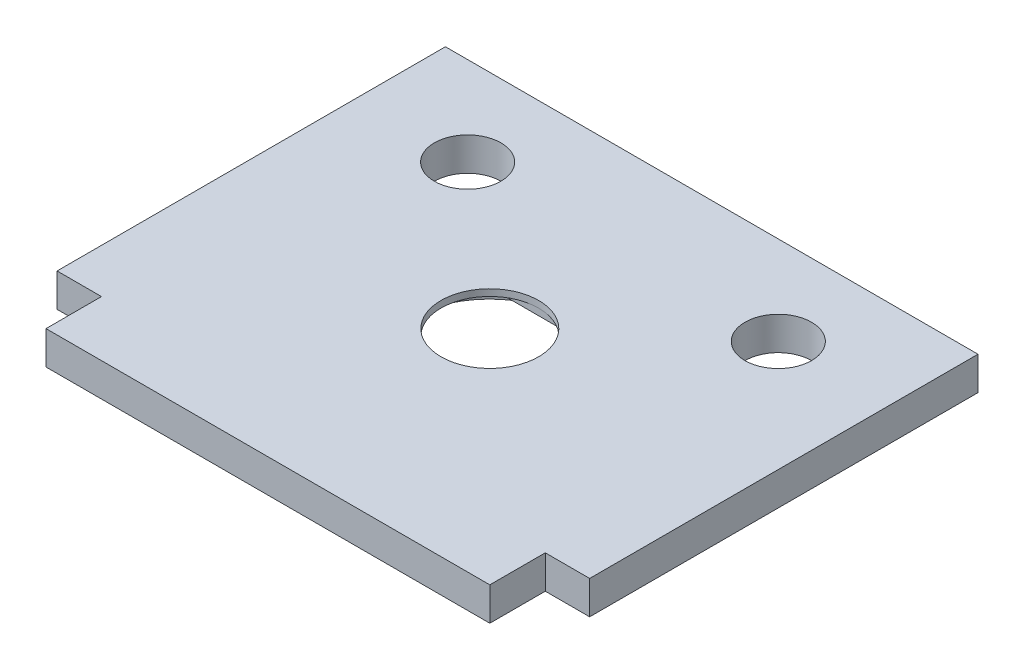
ISO-10303-21;
HEADER;
FILE_DESCRIPTION(('STEP AP214'),'2;1');
FILE_NAME('part.step','',(''),(''),'','','');
FILE_SCHEMA(('AUTOMOTIVE_DESIGN { 1 0 10303 214 1 1 1 1 }'));
ENDSEC;
DATA;
#1=APPLICATION_CONTEXT('core data for automotive mechanical design processes');
#2=APPLICATION_PROTOCOL_DEFINITION('international standard','automotive_design',2000,#1);
#3=PRODUCT_CONTEXT('',#1,'mechanical');
#4=PRODUCT('Part','Part','',(#3));
#5=PRODUCT_RELATED_PRODUCT_CATEGORY('part','',(#4));
#6=PRODUCT_DEFINITION_FORMATION('','',#4);
#7=PRODUCT_DEFINITION_CONTEXT('part definition',#1,'design');
#8=PRODUCT_DEFINITION('design','',#6,#7);
#9=PRODUCT_DEFINITION_SHAPE('','',#8);
#10=(LENGTH_UNIT() NAMED_UNIT(*) SI_UNIT(.MILLI.,.METRE.));
#11=(NAMED_UNIT(*) PLANE_ANGLE_UNIT() SI_UNIT($,.RADIAN.));
#12=(NAMED_UNIT(*) SI_UNIT($,.STERADIAN.) SOLID_ANGLE_UNIT());
#13=UNCERTAINTY_MEASURE_WITH_UNIT(LENGTH_MEASURE(1.E-05),#10,'distance_accuracy_value','');
#14=(GEOMETRIC_REPRESENTATION_CONTEXT(3) GLOBAL_UNCERTAINTY_ASSIGNED_CONTEXT((#13)) GLOBAL_UNIT_ASSIGNED_CONTEXT((#10,
#11,#12)) REPRESENTATION_CONTEXT('',''));
#15=CARTESIAN_POINT('',(0.,0.,0.));
#16=DIRECTION('',(0.,0.,1.));
#17=DIRECTION('',(1.,0.,0.));
#18=AXIS2_PLACEMENT_3D('',#15,#16,#17);
#19=CARTESIAN_POINT('',(-1.4300518134715,0.9,-7.5));
#20=DIRECTION('',(0.,-1.,0.));
#21=DIRECTION('',(0.,0.,-1.));
#22=AXIS2_PLACEMENT_3D('',#19,#20,#21);
#23=PLANE('',#22);
#24=DIRECTION('',(1.,0.,0.));
#25=VECTOR('',#24,1.);
#26=CARTESIAN_POINT('',(1.60680511434054,0.9,-9.7));
#27=LINE('',#26,#25);
#28=CARTESIAN_POINT('',(-4.46690874128355,0.9,-9.7));
#29=VERTEX_POINT('',#28);
#30=CARTESIAN_POINT('',(1.60680511434054,0.9,-9.7));
#31=VERTEX_POINT('',#30);
#32=EDGE_CURVE('E269',#29,#31,#27,.T.);
#33=ORIENTED_EDGE('',*,*,#32,.F.);
#34=CARTESIAN_POINT('',(-1.4300518134715,0.9,-7.5));
#35=DIRECTION('',(0.,-1.,0.));
#36=DIRECTION('',(0.,0.,-1.));
#37=AXIS2_PLACEMENT_3D('',#34,#35,#36);
#38=CIRCLE('',#37,3.75);
#39=EDGE_CURVE('E208',#29,#31,#38,.T.);
#40=ORIENTED_EDGE('',*,*,#39,.T.);
#41=EDGE_LOOP('',(#33,#40));
#42=FACE_BOUND('',#41,.T.);
#43=ADVANCED_FACE('F39',(#42),#23,.T.);
#44=CARTESIAN_POINT('',(-1.4300518134715,1.8,-7.5));
#45=DIRECTION('',(0.,-1.,0.));
#46=DIRECTION('',(0.,0.,-1.));
#47=AXIS2_PLACEMENT_3D('',#44,#45,#46);
#48=CYLINDRICAL_SURFACE('',#47,2.2);
#49=CARTESIAN_POINT('',(-1.4300518134715,1.5,-7.5));
#50=DIRECTION('',(0.,1.,0.));
#51=DIRECTION('',(0.,0.,1.));
#52=AXIS2_PLACEMENT_3D('',#49,#50,#51);
#53=CIRCLE('',#52,2.2);
#54=CARTESIAN_POINT('',(-1.4300518134715,1.5,-5.3));
#55=VERTEX_POINT('',#54);
#56=EDGE_CURVE('E198',#55,#55,#53,.T.);
#57=ORIENTED_EDGE('',*,*,#56,.T.);
#58=EDGE_LOOP('',(#57));
#59=FACE_BOUND('',#58,.T.);
#60=CARTESIAN_POINT('',(-1.4300518134715,1.2,-7.5));
#61=DIRECTION('',(0.,-1.,0.));
#62=DIRECTION('',(0.,0.,-1.));
#63=AXIS2_PLACEMENT_3D('',#60,#61,#62);
#64=CIRCLE('',#63,2.2);
#65=CARTESIAN_POINT('',(-1.4300518134715,1.2,-9.7));
#66=VERTEX_POINT('',#65);
#67=CARTESIAN_POINT('',(-1.4300518134715,1.2,-5.3));
#68=VERTEX_POINT('',#67);
#69=EDGE_CURVE('E11',#66,#68,#64,.F.);
#70=ORIENTED_EDGE('',*,*,#69,.F.);
#71=EDGE_CURVE('E43',#68,#66,#64,.F.);
#72=ORIENTED_EDGE('',*,*,#71,.F.);
#73=EDGE_LOOP('',(#70,#72));
#74=FACE_BOUND('',#73,.T.);
#75=ADVANCED_FACE('F299',(#59,#74),#48,.F.);
#76=CARTESIAN_POINT('',(10.5699481865285,1.5,-17.5));
#77=DIRECTION('',(0.,0.,1.));
#78=DIRECTION('',(1.,0.,0.));
#79=AXIS2_PLACEMENT_3D('',#76,#77,#78);
#80=PLANE('',#79);
#81=DIRECTION('',(-1.,0.,0.));
#82=VECTOR('',#81,1.);
#83=CARTESIAN_POINT('',(10.5699481865285,0.,-17.5));
#84=LINE('',#83,#82);
#85=CARTESIAN_POINT('',(10.5699481865285,0.,-17.5));
#86=VERTEX_POINT('',#85);
#87=CARTESIAN_POINT('',(-13.4300518134715,0.,-17.5));
#88=VERTEX_POINT('',#87);
#89=EDGE_CURVE('E153',#86,#88,#84,.T.);
#90=ORIENTED_EDGE('',*,*,#89,.T.);
#91=DIRECTION('',(0.,-1.,0.));
#92=VECTOR('',#91,1.);
#93=CARTESIAN_POINT('',(-13.4300518134715,1.5,-17.5));
#94=LINE('',#93,#92);
#95=CARTESIAN_POINT('',(-13.4300518134715,1.5,-17.5));
#96=VERTEX_POINT('',#95);
#97=EDGE_CURVE('E196',#96,#88,#94,.T.);
#98=ORIENTED_EDGE('',*,*,#97,.F.);
#99=DIRECTION('',(-1.,0.,0.));
#100=VECTOR('',#99,1.);
#101=CARTESIAN_POINT('',(10.5699481865285,1.5,-17.5));
#102=LINE('',#101,#100);
#103=CARTESIAN_POINT('',(10.5699481865285,1.5,-17.5));
#104=VERTEX_POINT('',#103);
#105=EDGE_CURVE('E177',#104,#96,#102,.T.);
#106=ORIENTED_EDGE('',*,*,#105,.F.);
#107=DIRECTION('',(0.,-1.,0.));
#108=VECTOR('',#107,1.);
#109=CARTESIAN_POINT('',(10.5699481865285,1.5,-17.5));
#110=LINE('',#109,#108);
#111=EDGE_CURVE('E149',#104,#86,#110,.T.);
#112=ORIENTED_EDGE('',*,*,#111,.T.);
#113=EDGE_LOOP('',(#90,#98,#106,#112));
#114=FACE_BOUND('',#113,.T.);
#115=ADVANCED_FACE('F41',(#114),#80,.F.);
#116=CARTESIAN_POINT('',(-13.4300518134715,1.5,-17.5));
#117=DIRECTION('',(1.,0.,0.));
#118=DIRECTION('',(0.,0.,-1.));
#119=AXIS2_PLACEMENT_3D('',#116,#117,#118);
#120=PLANE('',#119);
#121=DIRECTION('',(0.,0.,1.));
#122=VECTOR('',#121,1.);
#123=CARTESIAN_POINT('',(-13.4300518134715,0.,-17.5));
#124=LINE('',#123,#122);
#125=CARTESIAN_POINT('',(-13.4300518134715,0.,0.));
#126=VERTEX_POINT('',#125);
#127=EDGE_CURVE('E157',#88,#126,#124,.T.);
#128=ORIENTED_EDGE('',*,*,#127,.T.);
#129=DIRECTION('',(0.,-1.,0.));
#130=VECTOR('',#129,1.);
#131=CARTESIAN_POINT('',(-13.4300518134715,1.5,0.));
#132=LINE('',#131,#130);
#133=CARTESIAN_POINT('',(-13.4300518134715,1.5,0.));
#134=VERTEX_POINT('',#133);
#135=EDGE_CURVE('E192',#134,#126,#132,.T.);
#136=ORIENTED_EDGE('',*,*,#135,.F.);
#137=DIRECTION('',(0.,0.,1.));
#138=VECTOR('',#137,1.);
#139=CARTESIAN_POINT('',(-13.4300518134715,1.5,-17.5));
#140=LINE('',#139,#138);
#141=EDGE_CURVE('E106',#96,#134,#140,.T.);
#142=ORIENTED_EDGE('',*,*,#141,.F.);
#143=ORIENTED_EDGE('',*,*,#97,.T.);
#144=EDGE_LOOP('',(#128,#136,#142,#143));
#145=FACE_BOUND('',#144,.T.);
#146=ADVANCED_FACE('F306',(#145),#120,.F.);
#147=CARTESIAN_POINT('',(-13.4300518134715,1.5,0.));
#148=DIRECTION('',(0.,0.,-1.));
#149=DIRECTION('',(-1.,0.,0.));
#150=AXIS2_PLACEMENT_3D('',#147,#148,#149);
#151=PLANE('',#150);
#152=DIRECTION('',(1.,0.,0.));
#153=VECTOR('',#152,1.);
#154=CARTESIAN_POINT('',(-13.4300518134715,0.,0.));
#155=LINE('',#154,#153);
#156=CARTESIAN_POINT('',(-11.4300518134715,0.,0.));
#157=VERTEX_POINT('',#156);
#158=EDGE_CURVE('E161',#126,#157,#155,.T.);
#159=ORIENTED_EDGE('',*,*,#158,.T.);
#160=DIRECTION('',(0.,-1.,0.));
#161=VECTOR('',#160,1.);
#162=CARTESIAN_POINT('',(-11.4300518134715,1.5,0.));
#163=LINE('',#162,#161);
#164=CARTESIAN_POINT('',(-11.4300518134715,1.5,0.));
#165=VERTEX_POINT('',#164);
#166=EDGE_CURVE('E188',#165,#157,#163,.T.);
#167=ORIENTED_EDGE('',*,*,#166,.F.);
#168=DIRECTION('',(1.,0.,0.));
#169=VECTOR('',#168,1.);
#170=CARTESIAN_POINT('',(-13.4300518134715,1.5,0.));
#171=LINE('',#170,#169);
#172=EDGE_CURVE('E228',#134,#165,#171,.T.);
#173=ORIENTED_EDGE('',*,*,#172,.F.);
#174=ORIENTED_EDGE('',*,*,#135,.T.);
#175=EDGE_LOOP('',(#159,#167,#173,#174));
#176=FACE_BOUND('',#175,.T.);
#177=ADVANCED_FACE('F338',(#176),#151,.F.);
#178=CARTESIAN_POINT('',(-11.4300518134715,1.5,0.));
#179=DIRECTION('',(1.,0.,0.));
#180=DIRECTION('',(0.,0.,-1.));
#181=AXIS2_PLACEMENT_3D('',#178,#179,#180);
#182=PLANE('',#181);
#183=DIRECTION('',(0.,0.,1.));
#184=VECTOR('',#183,1.);
#185=CARTESIAN_POINT('',(-11.4300518134715,0.,0.));
#186=LINE('',#185,#184);
#187=CARTESIAN_POINT('',(-11.4300518134715,0.,2.5));
#188=VERTEX_POINT('',#187);
#189=EDGE_CURVE('E164',#157,#188,#186,.T.);
#190=ORIENTED_EDGE('',*,*,#189,.T.);
#191=DIRECTION('',(0.,-1.,0.));
#192=VECTOR('',#191,1.);
#193=CARTESIAN_POINT('',(-11.4300518134715,1.5,2.5));
#194=LINE('',#193,#192);
#195=CARTESIAN_POINT('',(-11.4300518134715,1.5,2.5));
#196=VERTEX_POINT('',#195);
#197=EDGE_CURVE('E184',#196,#188,#194,.T.);
#198=ORIENTED_EDGE('',*,*,#197,.F.);
#199=DIRECTION('',(0.,0.,1.));
#200=VECTOR('',#199,1.);
#201=CARTESIAN_POINT('',(-11.4300518134715,1.5,0.));
#202=LINE('',#201,#200);
#203=EDGE_CURVE('E231',#165,#196,#202,.T.);
#204=ORIENTED_EDGE('',*,*,#203,.F.);
#205=ORIENTED_EDGE('',*,*,#166,.T.);
#206=EDGE_LOOP('',(#190,#198,#204,#205));
#207=FACE_BOUND('',#206,.T.);
#208=ADVANCED_FACE('F334',(#207),#182,.F.);
#209=CARTESIAN_POINT('',(-11.4300518134715,1.5,2.5));
#210=DIRECTION('',(0.,0.,-1.));
#211=DIRECTION('',(-1.,0.,0.));
#212=AXIS2_PLACEMENT_3D('',#209,#210,#211);
#213=PLANE('',#212);
#214=DIRECTION('',(1.,0.,0.));
#215=VECTOR('',#214,1.);
#216=CARTESIAN_POINT('',(-11.4300518134715,0.,2.5));
#217=LINE('',#216,#215);
#218=CARTESIAN_POINT('',(8.5699481865285,0.,2.5));
#219=VERTEX_POINT('',#218);
#220=EDGE_CURVE('E167',#188,#219,#217,.T.);
#221=ORIENTED_EDGE('',*,*,#220,.T.);
#222=DIRECTION('',(0.,-1.,0.));
#223=VECTOR('',#222,1.);
#224=CARTESIAN_POINT('',(8.5699481865285,1.5,2.5));
#225=LINE('',#224,#223);
#226=CARTESIAN_POINT('',(8.5699481865285,1.5,2.5));
#227=VERTEX_POINT('',#226);
#228=EDGE_CURVE('E142',#227,#219,#225,.T.);
#229=ORIENTED_EDGE('',*,*,#228,.F.);
#230=DIRECTION('',(1.,0.,0.));
#231=VECTOR('',#230,1.);
#232=CARTESIAN_POINT('',(-11.4300518134715,1.5,2.5));
#233=LINE('',#232,#231);
#234=EDGE_CURVE('E128',#196,#227,#233,.T.);
#235=ORIENTED_EDGE('',*,*,#234,.F.);
#236=ORIENTED_EDGE('',*,*,#197,.T.);
#237=EDGE_LOOP('',(#221,#229,#235,#236));
#238=FACE_BOUND('',#237,.T.);
#239=ADVANCED_FACE('F331',(#238),#213,.F.);
#240=CARTESIAN_POINT('',(8.5699481865285,1.5,2.5));
#241=DIRECTION('',(-1.,0.,0.));
#242=DIRECTION('',(0.,0.,1.));
#243=AXIS2_PLACEMENT_3D('',#240,#241,#242);
#244=PLANE('',#243);
#245=DIRECTION('',(0.,0.,-1.));
#246=VECTOR('',#245,1.);
#247=CARTESIAN_POINT('',(8.5699481865285,0.,2.5));
#248=LINE('',#247,#246);
#249=CARTESIAN_POINT('',(8.5699481865285,0.,0.));
#250=VERTEX_POINT('',#249);
#251=EDGE_CURVE('E138',#219,#250,#248,.T.);
#252=ORIENTED_EDGE('',*,*,#251,.T.);
#253=DIRECTION('',(0.,-1.,0.));
#254=VECTOR('',#253,1.);
#255=CARTESIAN_POINT('',(8.5699481865285,1.5,0.));
#256=LINE('',#255,#254);
#257=CARTESIAN_POINT('',(8.5699481865285,1.5,0.));
#258=VERTEX_POINT('',#257);
#259=EDGE_CURVE('E135',#258,#250,#256,.T.);
#260=ORIENTED_EDGE('',*,*,#259,.F.);
#261=DIRECTION('',(0.,0.,-1.));
#262=VECTOR('',#261,1.);
#263=CARTESIAN_POINT('',(8.5699481865285,1.5,2.5));
#264=LINE('',#263,#262);
#265=EDGE_CURVE('E121',#227,#258,#264,.T.);
#266=ORIENTED_EDGE('',*,*,#265,.F.);
#267=ORIENTED_EDGE('',*,*,#228,.T.);
#268=EDGE_LOOP('',(#252,#260,#266,#267));
#269=FACE_BOUND('',#268,.T.);
#270=ADVANCED_FACE('F136',(#269),#244,.F.);
#271=CARTESIAN_POINT('',(8.5699481865285,1.5,0.));
#272=DIRECTION('',(0.,0.,-1.));
#273=DIRECTION('',(-1.,0.,0.));
#274=AXIS2_PLACEMENT_3D('',#271,#272,#273);
#275=PLANE('',#274);
#276=DIRECTION('',(1.,0.,0.));
#277=VECTOR('',#276,1.);
#278=CARTESIAN_POINT('',(8.5699481865285,0.,0.));
#279=LINE('',#278,#277);
#280=CARTESIAN_POINT('',(10.5699481865285,0.,0.));
#281=VERTEX_POINT('',#280);
#282=EDGE_CURVE('E172',#250,#281,#279,.T.);
#283=ORIENTED_EDGE('',*,*,#282,.T.);
#284=DIRECTION('',(0.,-1.,0.));
#285=VECTOR('',#284,1.);
#286=CARTESIAN_POINT('',(10.5699481865285,1.5,0.));
#287=LINE('',#286,#285);
#288=CARTESIAN_POINT('',(10.5699481865285,1.5,0.));
#289=VERTEX_POINT('',#288);
#290=EDGE_CURVE('E143',#289,#281,#287,.T.);
#291=ORIENTED_EDGE('',*,*,#290,.F.);
#292=DIRECTION('',(1.,0.,0.));
#293=VECTOR('',#292,1.);
#294=CARTESIAN_POINT('',(8.5699481865285,1.5,0.));
#295=LINE('',#294,#293);
#296=EDGE_CURVE('E125',#258,#289,#295,.T.);
#297=ORIENTED_EDGE('',*,*,#296,.F.);
#298=ORIENTED_EDGE('',*,*,#259,.T.);
#299=EDGE_LOOP('',(#283,#291,#297,#298));
#300=FACE_BOUND('',#299,.T.);
#301=ADVANCED_FACE('F145',(#300),#275,.F.);
#302=CARTESIAN_POINT('',(10.5699481865285,1.5,0.));
#303=DIRECTION('',(-1.,0.,0.));
#304=DIRECTION('',(0.,0.,1.));
#305=AXIS2_PLACEMENT_3D('',#302,#303,#304);
#306=PLANE('',#305);
#307=DIRECTION('',(0.,0.,-1.));
#308=VECTOR('',#307,1.);
#309=CARTESIAN_POINT('',(10.5699481865285,0.,0.));
#310=LINE('',#309,#308);
#311=EDGE_CURVE('E97',#281,#86,#310,.T.);
#312=ORIENTED_EDGE('',*,*,#311,.T.);
#313=ORIENTED_EDGE('',*,*,#111,.F.);
#314=DIRECTION('',(0.,0.,-1.));
#315=VECTOR('',#314,1.);
#316=CARTESIAN_POINT('',(10.5699481865285,1.5,0.));
#317=LINE('',#316,#315);
#318=EDGE_CURVE('E64',#289,#104,#317,.T.);
#319=ORIENTED_EDGE('',*,*,#318,.F.);
#320=ORIENTED_EDGE('',*,*,#290,.T.);
#321=EDGE_LOOP('',(#312,#313,#319,#320));
#322=FACE_BOUND('',#321,.T.);
#323=ADVANCED_FACE('F320',(#322),#306,.F.);
#324=CARTESIAN_POINT('',(0.,1.5,0.));
#325=DIRECTION('',(0.,1.,0.));
#326=DIRECTION('',(0.,0.,1.));
#327=AXIS2_PLACEMENT_3D('',#324,#325,#326);
#328=PLANE('',#327);
#329=CARTESIAN_POINT('',(-8.4300518134715,1.5,-13.5));
#330=DIRECTION('',(0.,1.,0.));
#331=DIRECTION('',(0.,0.,1.));
#332=AXIS2_PLACEMENT_3D('',#329,#330,#331);
#333=CIRCLE('',#332,1.5);
#334=CARTESIAN_POINT('',(-8.4300518134715,1.5,-12.));
#335=VERTEX_POINT('',#334);
#336=EDGE_CURVE('E202',#335,#335,#333,.T.);
#337=ORIENTED_EDGE('',*,*,#336,.F.);
#338=EDGE_LOOP('',(#337));
#339=FACE_BOUND('',#338,.T.);
#340=CARTESIAN_POINT('',(5.5699481865285,1.5,-13.5));
#341=DIRECTION('',(0.,1.,0.));
#342=DIRECTION('',(0.,0.,1.));
#343=AXIS2_PLACEMENT_3D('',#340,#341,#342);
#344=CIRCLE('',#343,1.5);
#345=CARTESIAN_POINT('',(5.5699481865285,1.5,-12.));
#346=VERTEX_POINT('',#345);
#347=EDGE_CURVE('E211',#346,#346,#344,.T.);
#348=ORIENTED_EDGE('',*,*,#347,.F.);
#349=EDGE_LOOP('',(#348));
#350=FACE_BOUND('',#349,.T.);
#351=ORIENTED_EDGE('',*,*,#56,.F.);
#352=EDGE_LOOP('',(#351));
#353=FACE_BOUND('',#352,.T.);
#354=ORIENTED_EDGE('',*,*,#105,.T.);
#355=ORIENTED_EDGE('',*,*,#141,.T.);
#356=ORIENTED_EDGE('',*,*,#172,.T.);
#357=ORIENTED_EDGE('',*,*,#203,.T.);
#358=ORIENTED_EDGE('',*,*,#234,.T.);
#359=ORIENTED_EDGE('',*,*,#265,.T.);
#360=ORIENTED_EDGE('',*,*,#296,.T.);
#361=ORIENTED_EDGE('',*,*,#318,.T.);
#362=EDGE_LOOP('',(#354,#355,#356,#357,#358,#359,#360,#361));
#363=FACE_BOUND('',#362,.T.);
#364=ADVANCED_FACE('F123',(#339,#350,#353,#363),#328,.T.);
#365=CARTESIAN_POINT('',(0.,0.,0.));
#366=DIRECTION('',(0.,1.,0.));
#367=DIRECTION('',(0.,0.,1.));
#368=AXIS2_PLACEMENT_3D('',#365,#366,#367);
#369=PLANE('',#368);
#370=CARTESIAN_POINT('',(-8.4300518134715,0.,-13.5));
#371=DIRECTION('',(0.,-1.,0.));
#372=DIRECTION('',(0.,0.,-1.));
#373=AXIS2_PLACEMENT_3D('',#370,#371,#372);
#374=CIRCLE('',#373,1.5);
#375=CARTESIAN_POINT('',(-8.4300518134715,0.,-15.));
#376=VERTEX_POINT('',#375);
#377=EDGE_CURVE('E217',#376,#376,#374,.T.);
#378=ORIENTED_EDGE('',*,*,#377,.F.);
#379=EDGE_LOOP('',(#378));
#380=FACE_BOUND('',#379,.T.);
#381=CARTESIAN_POINT('',(5.5699481865285,0.,-13.5));
#382=DIRECTION('',(0.,-1.,0.));
#383=DIRECTION('',(0.,0.,-1.));
#384=AXIS2_PLACEMENT_3D('',#381,#382,#383);
#385=CIRCLE('',#384,1.5);
#386=CARTESIAN_POINT('',(5.5699481865285,0.,-15.));
#387=VERTEX_POINT('',#386);
#388=EDGE_CURVE('E500',#387,#387,#385,.T.);
#389=ORIENTED_EDGE('',*,*,#388,.F.);
#390=EDGE_LOOP('',(#389));
#391=FACE_BOUND('',#390,.T.);
#392=CARTESIAN_POINT('',(-1.4300518134715,0.,-7.5));
#393=DIRECTION('',(0.,-1.,0.));
#394=DIRECTION('',(0.,0.,-1.));
#395=AXIS2_PLACEMENT_3D('',#392,#393,#394);
#396=CIRCLE('',#395,3.75);
#397=CARTESIAN_POINT('',(-1.4300518134715,0.,-11.25));
#398=VERTEX_POINT('',#397);
#399=EDGE_CURVE('E201',#398,#398,#396,.T.);
#400=ORIENTED_EDGE('',*,*,#399,.F.);
#401=EDGE_LOOP('',(#400));
#402=FACE_BOUND('',#401,.T.);
#403=ORIENTED_EDGE('',*,*,#89,.F.);
#404=ORIENTED_EDGE('',*,*,#311,.F.);
#405=ORIENTED_EDGE('',*,*,#282,.F.);
#406=ORIENTED_EDGE('',*,*,#251,.F.);
#407=ORIENTED_EDGE('',*,*,#220,.F.);
#408=ORIENTED_EDGE('',*,*,#189,.F.);
#409=ORIENTED_EDGE('',*,*,#158,.F.);
#410=ORIENTED_EDGE('',*,*,#127,.F.);
#411=EDGE_LOOP('',(#403,#404,#405,#406,#407,#408,#409,#410));
#412=FACE_BOUND('',#411,.T.);
#413=ADVANCED_FACE('F317',(#380,#391,#402,#412),#369,.F.);
#414=CARTESIAN_POINT('',(-1.4300518134715,0.9,-7.5));
#415=DIRECTION('',(0.,-1.,0.));
#416=DIRECTION('',(0.,0.,-1.));
#417=AXIS2_PLACEMENT_3D('',#414,#415,#416);
#418=CYLINDRICAL_SURFACE('',#417,3.75);
#419=CARTESIAN_POINT('',(1.60680511434054,0.9,-5.3));
#420=VERTEX_POINT('',#419);
#421=CARTESIAN_POINT('',(-4.46690874128355,0.9,-5.3));
#422=VERTEX_POINT('',#421);
#423=EDGE_CURVE('E158',#420,#422,#38,.T.);
#424=ORIENTED_EDGE('',*,*,#423,.F.);
#425=DIRECTION('',(0.,-1.,0.));
#426=VECTOR('',#425,1.);
#427=CARTESIAN_POINT('',(1.60680511434054,1.2,-5.3));
#428=LINE('',#427,#426);
#429=CARTESIAN_POINT('',(1.60680511434054,1.2,-5.3));
#430=VERTEX_POINT('',#429);
#431=EDGE_CURVE('E254',#430,#420,#428,.T.);
#432=ORIENTED_EDGE('',*,*,#431,.F.);
#433=CARTESIAN_POINT('',(-1.43005181347153,1.2,-7.5));
#434=DIRECTION('',(0.,-1.,0.));
#435=DIRECTION('',(0.,0.,-1.));
#436=AXIS2_PLACEMENT_3D('',#433,#434,#435);
#437=CIRCLE('',#436,3.75000000000002);
#438=CARTESIAN_POINT('',(1.60680511434054,1.2,-9.7));
#439=VERTEX_POINT('',#438);
#440=EDGE_CURVE('E494',#439,#430,#437,.T.);
#441=ORIENTED_EDGE('',*,*,#440,.F.);
#442=DIRECTION('',(0.,-1.,0.));
#443=VECTOR('',#442,1.);
#444=CARTESIAN_POINT('',(1.60680511434054,1.2,-9.7));
#445=LINE('',#444,#443);
#446=EDGE_CURVE('E292',#439,#31,#445,.T.);
#447=ORIENTED_EDGE('',*,*,#446,.T.);
#448=ORIENTED_EDGE('',*,*,#39,.F.);
#449=DIRECTION('',(0.,-1.,0.));
#450=VECTOR('',#449,1.);
#451=CARTESIAN_POINT('',(-4.46690874128355,1.2,-9.7));
#452=LINE('',#451,#450);
#453=CARTESIAN_POINT('',(-4.46690874128355,1.2,-9.7));
#454=VERTEX_POINT('',#453);
#455=EDGE_CURVE('E278',#454,#29,#452,.T.);
#456=ORIENTED_EDGE('',*,*,#455,.F.);
#457=CARTESIAN_POINT('',(-1.43005181347149,1.2,-7.5));
#458=DIRECTION('',(0.,-1.,0.));
#459=DIRECTION('',(0.,0.,-1.));
#460=AXIS2_PLACEMENT_3D('',#457,#458,#459);
#461=CIRCLE('',#460,3.75000000000002);
#462=CARTESIAN_POINT('',(-4.46690874128355,1.2,-5.3));
#463=VERTEX_POINT('',#462);
#464=EDGE_CURVE('E294',#463,#454,#461,.T.);
#465=ORIENTED_EDGE('',*,*,#464,.F.);
#466=DIRECTION('',(0.,-1.,0.));
#467=VECTOR('',#466,1.);
#468=CARTESIAN_POINT('',(-4.46690874128355,1.2,-5.3));
#469=LINE('',#468,#467);
#470=EDGE_CURVE('E257',#463,#422,#469,.T.);
#471=ORIENTED_EDGE('',*,*,#470,.T.);
#472=EDGE_LOOP('',(#424,#432,#441,#447,#448,#456,#465,#471));
#473=FACE_BOUND('',#472,.T.);
#474=ORIENTED_EDGE('',*,*,#399,.T.);
#475=EDGE_LOOP('',(#474));
#476=FACE_BOUND('',#475,.T.);
#477=ADVANCED_FACE('F250',(#473,#476),#418,.F.);
#478=DIRECTION('',(-1.,0.,0.));
#479=VECTOR('',#478,1.);
#480=CARTESIAN_POINT('',(1.60680511434054,0.9,-5.3));
#481=LINE('',#480,#479);
#482=EDGE_CURVE('E243',#420,#422,#481,.T.);
#483=ORIENTED_EDGE('',*,*,#482,.F.);
#484=ORIENTED_EDGE('',*,*,#423,.T.);
#485=EDGE_LOOP('',(#483,#484));
#486=FACE_BOUND('',#485,.T.);
#487=ADVANCED_FACE('F240',(#486),#23,.T.);
#488=CARTESIAN_POINT('',(5.5699481865285,6.,-13.5));
#489=DIRECTION('',(0.,-1.,0.));
#490=DIRECTION('',(0.,0.,-1.));
#491=AXIS2_PLACEMENT_3D('',#488,#489,#490);
#492=CYLINDRICAL_SURFACE('',#491,1.5);
#493=ORIENTED_EDGE('',*,*,#347,.T.);
#494=EDGE_LOOP('',(#493));
#495=FACE_BOUND('',#494,.T.);
#496=ORIENTED_EDGE('',*,*,#388,.T.);
#497=EDGE_LOOP('',(#496));
#498=FACE_BOUND('',#497,.T.);
#499=ADVANCED_FACE('F311',(#495,#498),#492,.F.);
#500=CARTESIAN_POINT('',(-8.4300518134715,6.,-13.5));
#501=DIRECTION('',(0.,-1.,0.));
#502=DIRECTION('',(0.,0.,-1.));
#503=AXIS2_PLACEMENT_3D('',#500,#501,#502);
#504=CYLINDRICAL_SURFACE('',#503,1.5);
#505=ORIENTED_EDGE('',*,*,#336,.T.);
#506=EDGE_LOOP('',(#505));
#507=FACE_BOUND('',#506,.T.);
#508=ORIENTED_EDGE('',*,*,#377,.T.);
#509=EDGE_LOOP('',(#508));
#510=FACE_BOUND('',#509,.T.);
#511=ADVANCED_FACE('F405',(#507,#510),#504,.F.);
#512=CARTESIAN_POINT('',(1.60680511434054,1.2,-9.7));
#513=DIRECTION('',(0.,0.,-1.));
#514=DIRECTION('',(-1.,0.,0.));
#515=AXIS2_PLACEMENT_3D('',#512,#513,#514);
#516=PLANE('',#515);
#517=ORIENTED_EDGE('',*,*,#32,.T.);
#518=ORIENTED_EDGE('',*,*,#446,.F.);
#519=DIRECTION('',(1.,0.,0.));
#520=VECTOR('',#519,1.);
#521=CARTESIAN_POINT('',(1.60680511434054,1.2,-9.7));
#522=LINE('',#521,#520);
#523=EDGE_CURVE('E282',#66,#439,#522,.T.);
#524=ORIENTED_EDGE('',*,*,#523,.F.);
#525=EDGE_CURVE('E291',#454,#66,#522,.T.);
#526=ORIENTED_EDGE('',*,*,#525,.F.);
#527=ORIENTED_EDGE('',*,*,#455,.T.);
#528=EDGE_LOOP('',(#517,#518,#524,#526,#527));
#529=FACE_BOUND('',#528,.T.);
#530=ADVANCED_FACE('F290',(#529),#516,.F.);
#531=CARTESIAN_POINT('',(1.60680511434054,1.2,-5.3));
#532=DIRECTION('',(0.,0.,1.));
#533=DIRECTION('',(1.,0.,0.));
#534=AXIS2_PLACEMENT_3D('',#531,#532,#533);
#535=PLANE('',#534);
#536=ORIENTED_EDGE('',*,*,#482,.T.);
#537=ORIENTED_EDGE('',*,*,#470,.F.);
#538=DIRECTION('',(-1.,0.,0.));
#539=VECTOR('',#538,1.);
#540=CARTESIAN_POINT('',(1.60680511434054,1.2,-5.3));
#541=LINE('',#540,#539);
#542=EDGE_CURVE('E519',#68,#463,#541,.T.);
#543=ORIENTED_EDGE('',*,*,#542,.F.);
#544=EDGE_CURVE('E55',#430,#68,#541,.T.);
#545=ORIENTED_EDGE('',*,*,#544,.F.);
#546=ORIENTED_EDGE('',*,*,#431,.T.);
#547=EDGE_LOOP('',(#536,#537,#543,#545,#546));
#548=FACE_BOUND('',#547,.T.);
#549=ADVANCED_FACE('F417',(#548),#535,.F.);
#550=CARTESIAN_POINT('',(-1.43005181347153,1.2,-7.5));
#551=DIRECTION('',(0.,-1.,0.));
#552=DIRECTION('',(0.,0.,-1.));
#553=AXIS2_PLACEMENT_3D('',#550,#551,#552);
#554=PLANE('',#553);
#555=ORIENTED_EDGE('',*,*,#69,.T.);
#556=ORIENTED_EDGE('',*,*,#542,.T.);
#557=ORIENTED_EDGE('',*,*,#464,.T.);
#558=ORIENTED_EDGE('',*,*,#525,.T.);
#559=EDGE_LOOP('',(#555,#556,#557,#558));
#560=FACE_BOUND('',#559,.T.);
#561=ADVANCED_FACE('F297',(#560),#554,.T.);
#562=ORIENTED_EDGE('',*,*,#71,.T.);
#563=ORIENTED_EDGE('',*,*,#523,.T.);
#564=ORIENTED_EDGE('',*,*,#440,.T.);
#565=ORIENTED_EDGE('',*,*,#544,.T.);
#566=EDGE_LOOP('',(#562,#563,#564,#565));
#567=FACE_BOUND('',#566,.T.);
#568=ADVANCED_FACE('F284',(#567),#554,.T.);
#569=CLOSED_SHELL('',(#43,#75,#115,#146,#177,#208,#239,#270,#301,#323,#364,#413,#477,#487,#499,
#511,#530,#549,#561,#568));
#570=MANIFOLD_SOLID_BREP('B2',#569);
#571=ADVANCED_BREP_SHAPE_REPRESENTATION('',(#18,#570),#14);
#572=SHAPE_DEFINITION_REPRESENTATION(#9,#571);
ENDSEC;
END-ISO-10303-21;
